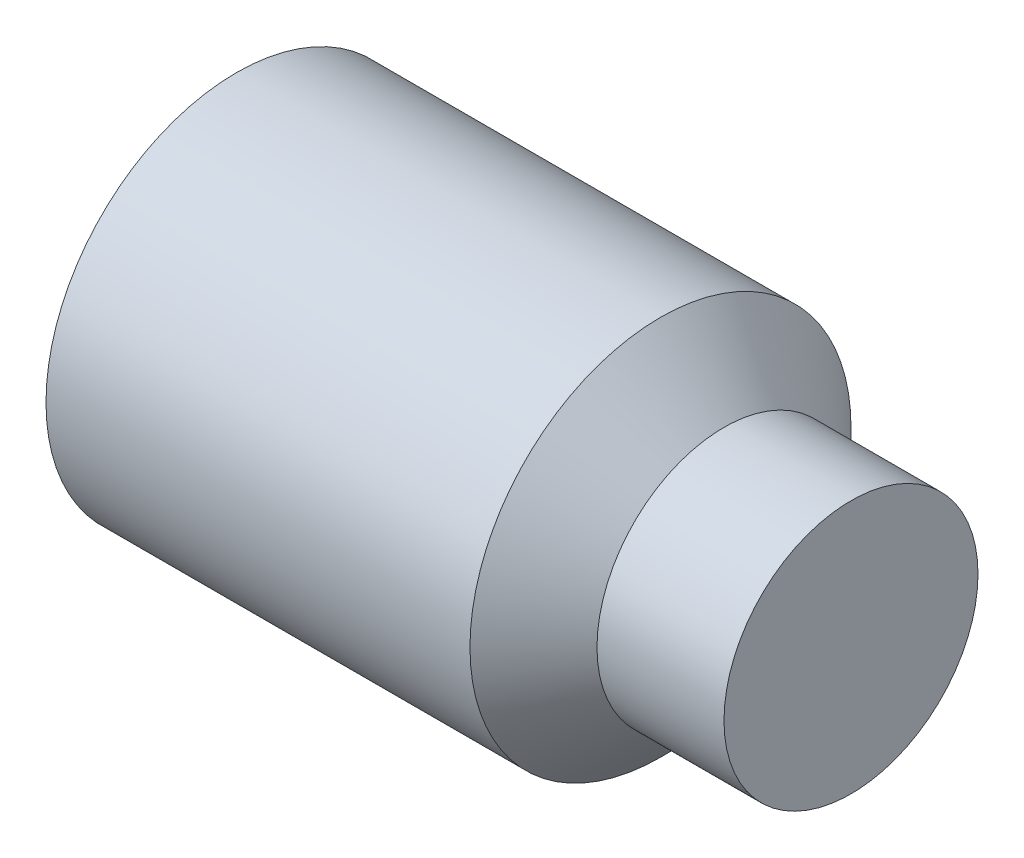
ISO-10303-21;
HEADER;
FILE_DESCRIPTION(('STEP AP214'),'2;1');
FILE_NAME('part.step','',(''),(''),'','','');
FILE_SCHEMA(('AUTOMOTIVE_DESIGN { 1 0 10303 214 1 1 1 1 }'));
ENDSEC;
DATA;
#1=APPLICATION_CONTEXT('core data for automotive mechanical design processes');
#2=APPLICATION_PROTOCOL_DEFINITION('international standard','automotive_design',2000,#1);
#3=PRODUCT_CONTEXT('',#1,'mechanical');
#4=PRODUCT('Part','Part','',(#3));
#5=PRODUCT_RELATED_PRODUCT_CATEGORY('part','',(#4));
#6=PRODUCT_DEFINITION_FORMATION('','',#4);
#7=PRODUCT_DEFINITION_CONTEXT('part definition',#1,'design');
#8=PRODUCT_DEFINITION('design','',#6,#7);
#9=PRODUCT_DEFINITION_SHAPE('','',#8);
#10=(LENGTH_UNIT() NAMED_UNIT(*) SI_UNIT(.MILLI.,.METRE.));
#11=(NAMED_UNIT(*) PLANE_ANGLE_UNIT() SI_UNIT($,.RADIAN.));
#12=(NAMED_UNIT(*) SI_UNIT($,.STERADIAN.) SOLID_ANGLE_UNIT());
#13=UNCERTAINTY_MEASURE_WITH_UNIT(LENGTH_MEASURE(1.E-05),#10,'distance_accuracy_value','');
#14=(GEOMETRIC_REPRESENTATION_CONTEXT(3) GLOBAL_UNCERTAINTY_ASSIGNED_CONTEXT((#13)) GLOBAL_UNIT_ASSIGNED_CONTEXT((#10,
#11,#12)) REPRESENTATION_CONTEXT('',''));
#15=CARTESIAN_POINT('',(0.,0.,0.));
#16=DIRECTION('',(0.,0.,1.));
#17=DIRECTION('',(1.,0.,0.));
#18=AXIS2_PLACEMENT_3D('',#15,#16,#17);
#19=CARTESIAN_POINT('',(0.,0.,0.));
#20=DIRECTION('',(-1.,0.,0.));
#21=DIRECTION('',(0.,0.,1.));
#22=AXIS2_PLACEMENT_3D('',#19,#20,#21);
#23=PLANE('',#22);
#24=CARTESIAN_POINT('',(0.,0.,0.));
#25=DIRECTION('',(-1.,0.,0.));
#26=DIRECTION('',(0.,0.,1.));
#27=AXIS2_PLACEMENT_3D('',#24,#25,#26);
#28=CIRCLE('',#27,1.2195);
#29=CARTESIAN_POINT('',(0.,0.,1.2195));
#30=VERTEX_POINT('',#29);
#31=EDGE_CURVE('E11',#30,#30,#28,.T.);
#32=ORIENTED_EDGE('',*,*,#31,.T.);
#33=EDGE_LOOP('',(#32));
#34=FACE_BOUND('',#33,.T.);
#35=DIRECTION('',(0.,0.,-1.));
#36=VECTOR('',#35,1.);
#37=CARTESIAN_POINT('',(0.,0.75,0.433012701892218));
#38=LINE('',#37,#36);
#39=CARTESIAN_POINT('',(0.,0.75,0.433012701892218));
#40=VERTEX_POINT('',#39);
#41=CARTESIAN_POINT('',(0.,0.75,-0.433012701892219));
#42=VERTEX_POINT('',#41);
#43=EDGE_CURVE('E136',#40,#42,#38,.T.);
#44=ORIENTED_EDGE('',*,*,#43,.F.);
#45=DIRECTION('',(0.,-0.866025403784438,0.5));
#46=VECTOR('',#45,1.);
#47=CARTESIAN_POINT('',(0.,0.75,0.433012701892218));
#48=LINE('',#47,#46);
#49=CARTESIAN_POINT('',(0.,0.,0.866025403784437));
#50=VERTEX_POINT('',#49);
#51=EDGE_CURVE('E58',#40,#50,#48,.T.);
#52=ORIENTED_EDGE('',*,*,#51,.T.);
#53=DIRECTION('',(0.,0.866025403784439,0.5));
#54=VECTOR('',#53,1.);
#55=CARTESIAN_POINT('',(0.,-0.749999999999998,0.433012701892219));
#56=LINE('',#55,#54);
#57=CARTESIAN_POINT('',(0.,-0.749999999999998,0.433012701892219));
#58=VERTEX_POINT('',#57);
#59=EDGE_CURVE('E127',#58,#50,#56,.T.);
#60=ORIENTED_EDGE('',*,*,#59,.F.);
#61=DIRECTION('',(0.,0.,-1.));
#62=VECTOR('',#61,1.);
#63=CARTESIAN_POINT('',(0.,-0.749999999999998,0.433012701892219));
#64=LINE('',#63,#62);
#65=CARTESIAN_POINT('',(0.,-0.749999999999998,-0.433012701892219));
#66=VERTEX_POINT('',#65);
#67=EDGE_CURVE('E130',#58,#66,#64,.T.);
#68=ORIENTED_EDGE('',*,*,#67,.T.);
#69=DIRECTION('',(0.,0.866025403784438,-0.500000000000001));
#70=VECTOR('',#69,1.);
#71=CARTESIAN_POINT('',(0.,-0.749999999999998,-0.433012701892219));
#72=LINE('',#71,#70);
#73=CARTESIAN_POINT('',(0.,0.,-0.866025403784438));
#74=VERTEX_POINT('',#73);
#75=EDGE_CURVE('E133',#66,#74,#72,.T.);
#76=ORIENTED_EDGE('',*,*,#75,.T.);
#77=DIRECTION('',(0.,-0.866025403784439,-0.5));
#78=VECTOR('',#77,1.);
#79=CARTESIAN_POINT('',(0.,0.75,-0.433012701892219));
#80=LINE('',#79,#78);
#81=EDGE_CURVE('E116',#42,#74,#80,.T.);
#82=ORIENTED_EDGE('',*,*,#81,.F.);
#83=EDGE_LOOP('',(#44,#52,#60,#68,#76,#82));
#84=FACE_BOUND('',#83,.T.);
#85=ADVANCED_FACE('F44',(#34,#84),#23,.T.);
#86=CARTESIAN_POINT('',(0.,0.,0.));
#87=DIRECTION('',(1.,0.,0.));
#88=DIRECTION('',(0.,0.,-1.));
#89=AXIS2_PLACEMENT_3D('',#86,#87,#88);
#90=CONICAL_SURFACE('',#89,1.2195,1.0471975511966);
#91=CARTESIAN_POINT('',(0.161946750507689,0.,0.));
#92=DIRECTION('',(-1.,0.,0.));
#93=DIRECTION('',(0.,0.,1.));
#94=AXIS2_PLACEMENT_3D('',#91,#92,#93);
#95=CIRCLE('',#94,1.5);
#96=CARTESIAN_POINT('',(0.161946750507689,0.,1.5));
#97=VERTEX_POINT('',#96);
#98=EDGE_CURVE('E51',#97,#97,#95,.T.);
#99=ORIENTED_EDGE('',*,*,#98,.T.);
#100=EDGE_LOOP('',(#99));
#101=FACE_BOUND('',#100,.T.);
#102=ORIENTED_EDGE('',*,*,#31,.F.);
#103=EDGE_LOOP('',(#102));
#104=FACE_BOUND('',#103,.T.);
#105=ADVANCED_FACE('F156',(#101,#104),#90,.T.);
#106=CARTESIAN_POINT('',(-12.7,0.,0.));
#107=DIRECTION('',(-1.,0.,0.));
#108=DIRECTION('',(0.,0.,1.));
#109=AXIS2_PLACEMENT_3D('',#106,#107,#108);
#110=CYLINDRICAL_SURFACE('',#109,1.5);
#111=CARTESIAN_POINT('',(3.5,0.,0.));
#112=DIRECTION('',(-1.,0.,0.));
#113=DIRECTION('',(0.,0.,1.));
#114=AXIS2_PLACEMENT_3D('',#111,#112,#113);
#115=CIRCLE('',#114,1.5);
#116=CARTESIAN_POINT('',(3.5,0.,1.5));
#117=VERTEX_POINT('',#116);
#118=EDGE_CURVE('E151',#117,#117,#115,.T.);
#119=ORIENTED_EDGE('',*,*,#118,.T.);
#120=EDGE_LOOP('',(#119));
#121=FACE_BOUND('',#120,.T.);
#122=ORIENTED_EDGE('',*,*,#98,.F.);
#123=EDGE_LOOP('',(#122));
#124=FACE_BOUND('',#123,.T.);
#125=ADVANCED_FACE('F159',(#121,#124),#110,.T.);
#126=CARTESIAN_POINT('',(3.5,0.,0.));
#127=DIRECTION('',(-1.,0.,0.));
#128=DIRECTION('',(0.,0.,1.));
#129=AXIS2_PLACEMENT_3D('',#126,#127,#128);
#130=CONICAL_SURFACE('',#129,1.5,0.785398163397451);
#131=CARTESIAN_POINT('',(4.,0.,0.));
#132=DIRECTION('',(-1.,0.,0.));
#133=DIRECTION('',(0.,0.,1.));
#134=AXIS2_PLACEMENT_3D('',#131,#132,#133);
#135=CIRCLE('',#134,1.);
#136=CARTESIAN_POINT('',(4.,0.,1.));
#137=VERTEX_POINT('',#136);
#138=EDGE_CURVE('E148',#137,#137,#135,.T.);
#139=ORIENTED_EDGE('',*,*,#138,.T.);
#140=EDGE_LOOP('',(#139));
#141=FACE_BOUND('',#140,.T.);
#142=ORIENTED_EDGE('',*,*,#118,.F.);
#143=EDGE_LOOP('',(#142));
#144=FACE_BOUND('',#143,.T.);
#145=ADVANCED_FACE('F161',(#141,#144),#130,.T.);
#146=CARTESIAN_POINT('',(-12.7,0.,0.));
#147=DIRECTION('',(-1.,0.,0.));
#148=DIRECTION('',(0.,0.,1.));
#149=AXIS2_PLACEMENT_3D('',#146,#147,#148);
#150=CYLINDRICAL_SURFACE('',#149,1.);
#151=CARTESIAN_POINT('',(5.,0.,0.));
#152=DIRECTION('',(-1.,0.,0.));
#153=DIRECTION('',(0.,0.,1.));
#154=AXIS2_PLACEMENT_3D('',#151,#152,#153);
#155=CIRCLE('',#154,1.);
#156=CARTESIAN_POINT('',(5.,0.,1.));
#157=VERTEX_POINT('',#156);
#158=EDGE_CURVE('E145',#157,#157,#155,.T.);
#159=ORIENTED_EDGE('',*,*,#158,.T.);
#160=EDGE_LOOP('',(#159));
#161=FACE_BOUND('',#160,.T.);
#162=ORIENTED_EDGE('',*,*,#138,.F.);
#163=EDGE_LOOP('',(#162));
#164=FACE_BOUND('',#163,.T.);
#165=ADVANCED_FACE('F168',(#161,#164),#150,.T.);
#166=CARTESIAN_POINT('',(5.,1.,0.));
#167=DIRECTION('',(1.,0.,0.));
#168=DIRECTION('',(0.,0.,-1.));
#169=AXIS2_PLACEMENT_3D('',#166,#167,#168);
#170=PLANE('',#169);
#171=ORIENTED_EDGE('',*,*,#158,.F.);
#172=EDGE_LOOP('',(#171));
#173=FACE_BOUND('',#172,.T.);
#174=ADVANCED_FACE('F205',(#173),#170,.T.);
#175=CARTESIAN_POINT('',(1.2,0.75,0.433012701892218));
#176=DIRECTION('',(0.,-0.5,-0.866025403784438));
#177=DIRECTION('',(0.,0.866025403784438,-0.5));
#178=AXIS2_PLACEMENT_3D('',#175,#176,#177);
#179=PLANE('',#178);
#180=ORIENTED_EDGE('',*,*,#51,.F.);
#181=DIRECTION('',(-1.,0.,0.));
#182=VECTOR('',#181,1.);
#183=CARTESIAN_POINT('',(1.2,0.75,0.433012701892218));
#184=LINE('',#183,#182);
#185=CARTESIAN_POINT('',(1.2,0.75,0.433012701892218));
#186=VERTEX_POINT('',#185);
#187=EDGE_CURVE('E63',#186,#40,#184,.T.);
#188=ORIENTED_EDGE('',*,*,#187,.F.);
#189=DIRECTION('',(0.,-0.866025403784438,0.5));
#190=VECTOR('',#189,1.);
#191=CARTESIAN_POINT('',(1.2,0.75,0.433012701892218));
#192=LINE('',#191,#190);
#193=CARTESIAN_POINT('',(1.2,0.,0.866025403784437));
#194=VERTEX_POINT('',#193);
#195=EDGE_CURVE('E90',#186,#194,#192,.T.);
#196=ORIENTED_EDGE('',*,*,#195,.T.);
#197=DIRECTION('',(-1.,0.,0.));
#198=VECTOR('',#197,1.);
#199=CARTESIAN_POINT('',(1.2,0.,0.866025403784437));
#200=LINE('',#199,#198);
#201=EDGE_CURVE('E143',#194,#50,#200,.T.);
#202=ORIENTED_EDGE('',*,*,#201,.T.);
#203=EDGE_LOOP('',(#180,#188,#196,#202));
#204=FACE_BOUND('',#203,.T.);
#205=ADVANCED_FACE('F202',(#204),#179,.T.);
#206=CARTESIAN_POINT('',(1.2,-0.749999999999998,0.433012701892219));
#207=DIRECTION('',(0.,-0.5,0.866025403784439));
#208=DIRECTION('',(0.,-0.866025403784439,-0.5));
#209=AXIS2_PLACEMENT_3D('',#206,#207,#208);
#210=PLANE('',#209);
#211=ORIENTED_EDGE('',*,*,#59,.T.);
#212=ORIENTED_EDGE('',*,*,#201,.F.);
#213=DIRECTION('',(0.,0.866025403784439,0.5));
#214=VECTOR('',#213,1.);
#215=CARTESIAN_POINT('',(1.2,-0.749999999999998,0.433012701892219));
#216=LINE('',#215,#214);
#217=CARTESIAN_POINT('',(1.2,-0.749999999999998,0.433012701892219));
#218=VERTEX_POINT('',#217);
#219=EDGE_CURVE('E297',#218,#194,#216,.T.);
#220=ORIENTED_EDGE('',*,*,#219,.F.);
#221=DIRECTION('',(-1.,0.,0.));
#222=VECTOR('',#221,1.);
#223=CARTESIAN_POINT('',(1.2,-0.749999999999998,0.433012701892219));
#224=LINE('',#223,#222);
#225=EDGE_CURVE('E141',#218,#58,#224,.T.);
#226=ORIENTED_EDGE('',*,*,#225,.T.);
#227=EDGE_LOOP('',(#211,#212,#220,#226));
#228=FACE_BOUND('',#227,.T.);
#229=ADVANCED_FACE('F198',(#228),#210,.F.);
#230=CARTESIAN_POINT('',(1.2,-0.749999999999998,0.433012701892219));
#231=DIRECTION('',(0.,1.,0.));
#232=DIRECTION('',(0.,0.,1.));
#233=AXIS2_PLACEMENT_3D('',#230,#231,#232);
#234=PLANE('',#233);
#235=ORIENTED_EDGE('',*,*,#67,.F.);
#236=ORIENTED_EDGE('',*,*,#225,.F.);
#237=DIRECTION('',(0.,0.,-1.));
#238=VECTOR('',#237,1.);
#239=CARTESIAN_POINT('',(1.2,-0.749999999999998,0.433012701892219));
#240=LINE('',#239,#238);
#241=CARTESIAN_POINT('',(1.2,-0.749999999999998,-0.433012701892219));
#242=VERTEX_POINT('',#241);
#243=EDGE_CURVE('E111',#218,#242,#240,.T.);
#244=ORIENTED_EDGE('',*,*,#243,.T.);
#245=DIRECTION('',(-1.,0.,0.));
#246=VECTOR('',#245,1.);
#247=CARTESIAN_POINT('',(1.2,-0.749999999999998,-0.433012701892219));
#248=LINE('',#247,#246);
#249=EDGE_CURVE('E106',#242,#66,#248,.T.);
#250=ORIENTED_EDGE('',*,*,#249,.T.);
#251=EDGE_LOOP('',(#235,#236,#244,#250));
#252=FACE_BOUND('',#251,.T.);
#253=ADVANCED_FACE('F195',(#252),#234,.T.);
#254=CARTESIAN_POINT('',(1.2,-0.749999999999998,-0.433012701892219));
#255=DIRECTION('',(0.,0.500000000000001,0.866025403784438));
#256=DIRECTION('',(0.,-0.866025403784438,0.500000000000001));
#257=AXIS2_PLACEMENT_3D('',#254,#255,#256);
#258=PLANE('',#257);
#259=ORIENTED_EDGE('',*,*,#75,.F.);
#260=ORIENTED_EDGE('',*,*,#249,.F.);
#261=DIRECTION('',(0.,0.866025403784438,-0.500000000000001));
#262=VECTOR('',#261,1.);
#263=CARTESIAN_POINT('',(1.2,-0.749999999999998,-0.433012701892219));
#264=LINE('',#263,#262);
#265=CARTESIAN_POINT('',(1.2,0.,-0.866025403784438));
#266=VERTEX_POINT('',#265);
#267=EDGE_CURVE('E101',#242,#266,#264,.T.);
#268=ORIENTED_EDGE('',*,*,#267,.T.);
#269=DIRECTION('',(-1.,0.,0.));
#270=VECTOR('',#269,1.);
#271=CARTESIAN_POINT('',(1.2,0.,-0.866025403784438));
#272=LINE('',#271,#270);
#273=EDGE_CURVE('E105',#266,#74,#272,.T.);
#274=ORIENTED_EDGE('',*,*,#273,.T.);
#275=EDGE_LOOP('',(#259,#260,#268,#274));
#276=FACE_BOUND('',#275,.T.);
#277=ADVANCED_FACE('F104',(#276),#258,.T.);
#278=CARTESIAN_POINT('',(1.2,0.75,-0.433012701892219));
#279=DIRECTION('',(0.,0.5,-0.866025403784439));
#280=DIRECTION('',(0.,0.866025403784439,0.5));
#281=AXIS2_PLACEMENT_3D('',#278,#279,#280);
#282=PLANE('',#281);
#283=ORIENTED_EDGE('',*,*,#81,.T.);
#284=ORIENTED_EDGE('',*,*,#273,.F.);
#285=DIRECTION('',(0.,-0.866025403784439,-0.5));
#286=VECTOR('',#285,1.);
#287=CARTESIAN_POINT('',(1.2,0.75,-0.433012701892219));
#288=LINE('',#287,#286);
#289=CARTESIAN_POINT('',(1.2,0.75,-0.433012701892219));
#290=VERTEX_POINT('',#289);
#291=EDGE_CURVE('E110',#290,#266,#288,.T.);
#292=ORIENTED_EDGE('',*,*,#291,.F.);
#293=DIRECTION('',(-1.,0.,0.));
#294=VECTOR('',#293,1.);
#295=CARTESIAN_POINT('',(1.2,0.75,-0.433012701892219));
#296=LINE('',#295,#294);
#297=EDGE_CURVE('E86',#290,#42,#296,.T.);
#298=ORIENTED_EDGE('',*,*,#297,.T.);
#299=EDGE_LOOP('',(#283,#284,#292,#298));
#300=FACE_BOUND('',#299,.T.);
#301=ADVANCED_FACE('F113',(#300),#282,.F.);
#302=CARTESIAN_POINT('',(1.2,0.75,0.433012701892218));
#303=DIRECTION('',(0.,1.,0.));
#304=DIRECTION('',(0.,0.,1.));
#305=AXIS2_PLACEMENT_3D('',#302,#303,#304);
#306=PLANE('',#305);
#307=ORIENTED_EDGE('',*,*,#43,.T.);
#308=ORIENTED_EDGE('',*,*,#297,.F.);
#309=DIRECTION('',(0.,0.,-1.));
#310=VECTOR('',#309,1.);
#311=CARTESIAN_POINT('',(1.2,0.75,0.433012701892218));
#312=LINE('',#311,#310);
#313=EDGE_CURVE('E121',#186,#290,#312,.T.);
#314=ORIENTED_EDGE('',*,*,#313,.F.);
#315=ORIENTED_EDGE('',*,*,#187,.T.);
#316=EDGE_LOOP('',(#307,#308,#314,#315));
#317=FACE_BOUND('',#316,.T.);
#318=ADVANCED_FACE('F183',(#317),#306,.F.);
#319=CARTESIAN_POINT('',(1.2,1.5,0.));
#320=DIRECTION('',(1.,0.,0.));
#321=DIRECTION('',(0.,0.,-1.));
#322=AXIS2_PLACEMENT_3D('',#319,#320,#321);
#323=PLANE('',#322);
#324=ORIENTED_EDGE('',*,*,#195,.F.);
#325=ORIENTED_EDGE('',*,*,#313,.T.);
#326=ORIENTED_EDGE('',*,*,#291,.T.);
#327=ORIENTED_EDGE('',*,*,#267,.F.);
#328=ORIENTED_EDGE('',*,*,#243,.F.);
#329=ORIENTED_EDGE('',*,*,#219,.T.);
#330=EDGE_LOOP('',(#324,#325,#326,#327,#328,#329));
#331=FACE_BOUND('',#330,.T.);
#332=ADVANCED_FACE('F119',(#331),#323,.F.);
#333=CLOSED_SHELL('',(#85,#105,#125,#145,#165,#174,#205,#229,#253,#277,#301,#318,#332));
#334=MANIFOLD_SOLID_BREP('B2',#333);
#335=ADVANCED_BREP_SHAPE_REPRESENTATION('',(#18,#334),#14);
#336=SHAPE_DEFINITION_REPRESENTATION(#9,#335);
ENDSEC;
END-ISO-10303-21;
